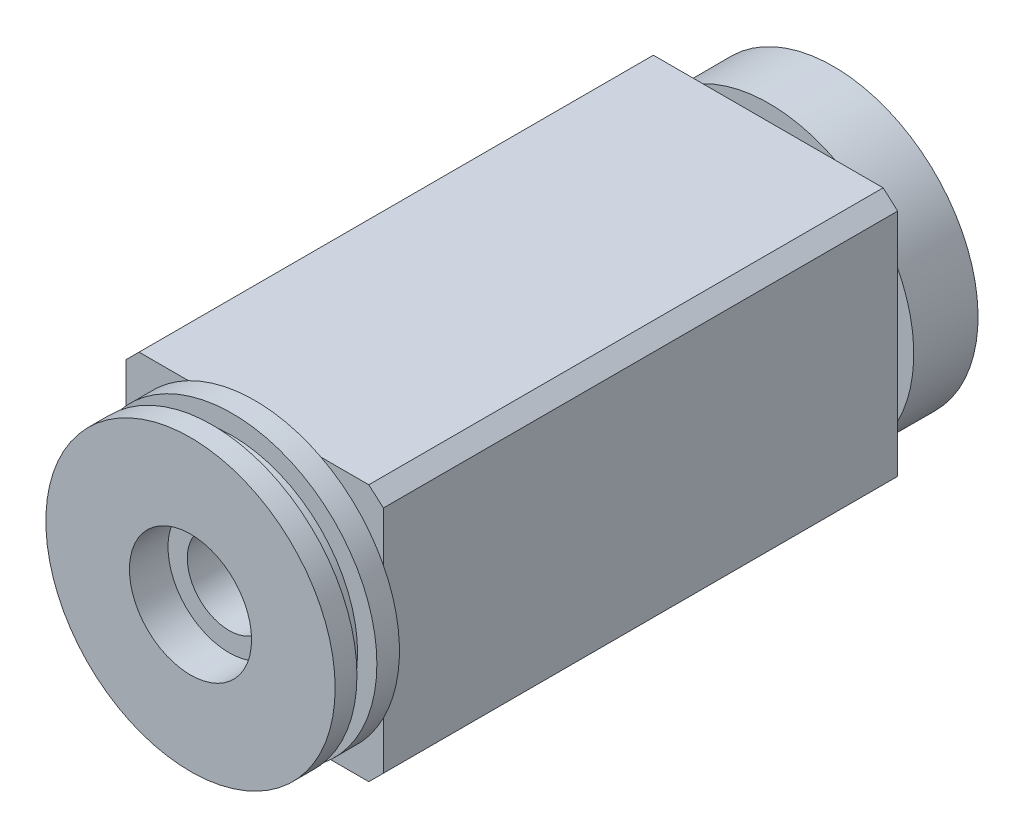
ISO-10303-21;
HEADER;
FILE_DESCRIPTION(('STEP AP214'),'2;1');
FILE_NAME('part.step','',(''),(''),'','','');
FILE_SCHEMA(('AUTOMOTIVE_DESIGN { 1 0 10303 214 1 1 1 1 }'));
ENDSEC;
DATA;
#1=APPLICATION_CONTEXT('core data for automotive mechanical design processes');
#2=APPLICATION_PROTOCOL_DEFINITION('international standard','automotive_design',2000,#1);
#3=PRODUCT_CONTEXT('',#1,'mechanical');
#4=PRODUCT('Part','Part','',(#3));
#5=PRODUCT_RELATED_PRODUCT_CATEGORY('part','',(#4));
#6=PRODUCT_DEFINITION_FORMATION('','',#4);
#7=PRODUCT_DEFINITION_CONTEXT('part definition',#1,'design');
#8=PRODUCT_DEFINITION('design','',#6,#7);
#9=PRODUCT_DEFINITION_SHAPE('','',#8);
#10=(LENGTH_UNIT() NAMED_UNIT(*) SI_UNIT(.MILLI.,.METRE.));
#11=(NAMED_UNIT(*) PLANE_ANGLE_UNIT() SI_UNIT($,.RADIAN.));
#12=(NAMED_UNIT(*) SI_UNIT($,.STERADIAN.) SOLID_ANGLE_UNIT());
#13=UNCERTAINTY_MEASURE_WITH_UNIT(LENGTH_MEASURE(1.E-05),#10,'distance_accuracy_value','');
#14=(GEOMETRIC_REPRESENTATION_CONTEXT(3) GLOBAL_UNCERTAINTY_ASSIGNED_CONTEXT((#13)) GLOBAL_UNIT_ASSIGNED_CONTEXT((#10,
#11,#12)) REPRESENTATION_CONTEXT('',''));
#15=CARTESIAN_POINT('',(0.,0.,0.));
#16=DIRECTION('',(0.,0.,1.));
#17=DIRECTION('',(1.,0.,0.));
#18=AXIS2_PLACEMENT_3D('',#15,#16,#17);
#19=CARTESIAN_POINT('',(0.,0.,90.));
#20=DIRECTION('',(0.,0.,-1.));
#21=DIRECTION('',(-1.,0.,0.));
#22=AXIS2_PLACEMENT_3D('',#19,#20,#21);
#23=CYLINDRICAL_SURFACE('',#22,22.5);
#24=CARTESIAN_POINT('',(0.,0.,80.));
#25=DIRECTION('',(0.,0.,1.));
#26=DIRECTION('',(1.,0.,0.));
#27=AXIS2_PLACEMENT_3D('',#24,#25,#26);
#28=CIRCLE('',#27,22.5);
#29=CARTESIAN_POINT('',(20.,10.3077640640442,80.));
#30=VERTEX_POINT('',#29);
#31=CARTESIAN_POINT('',(10.3077640640442,20.,80.));
#32=VERTEX_POINT('',#31);
#33=EDGE_CURVE('E245',#30,#32,#28,.T.);
#34=ORIENTED_EDGE('',*,*,#33,.T.);
#35=CARTESIAN_POINT('',(-10.3077640640442,20.,80.));
#36=VERTEX_POINT('',#35);
#37=EDGE_CURVE('E185',#32,#36,#28,.T.);
#38=ORIENTED_EDGE('',*,*,#37,.T.);
#39=CARTESIAN_POINT('',(-20.,10.3077640640442,80.));
#40=VERTEX_POINT('',#39);
#41=EDGE_CURVE('E181',#36,#40,#28,.T.);
#42=ORIENTED_EDGE('',*,*,#41,.T.);
#43=CARTESIAN_POINT('',(-20.,-10.3077640640442,80.));
#44=VERTEX_POINT('',#43);
#45=EDGE_CURVE('E254',#40,#44,#28,.T.);
#46=ORIENTED_EDGE('',*,*,#45,.T.);
#47=CARTESIAN_POINT('',(-10.3077640640442,-20.,80.));
#48=VERTEX_POINT('',#47);
#49=EDGE_CURVE('E183',#44,#48,#28,.T.);
#50=ORIENTED_EDGE('',*,*,#49,.T.);
#51=CARTESIAN_POINT('',(10.3077640640442,-20.,80.));
#52=VERTEX_POINT('',#51);
#53=EDGE_CURVE('E255',#48,#52,#28,.T.);
#54=ORIENTED_EDGE('',*,*,#53,.T.);
#55=CARTESIAN_POINT('',(20.,-10.3077640640442,80.));
#56=VERTEX_POINT('',#55);
#57=EDGE_CURVE('E241',#52,#56,#28,.T.);
#58=ORIENTED_EDGE('',*,*,#57,.T.);
#59=EDGE_CURVE('E191',#56,#30,#28,.T.);
#60=ORIENTED_EDGE('',*,*,#59,.T.);
#61=EDGE_LOOP('',(#34,#38,#42,#46,#50,#54,#58,#60));
#62=FACE_BOUND('',#61,.T.);
#63=CARTESIAN_POINT('',(0.,0.,83.51));
#64=DIRECTION('',(0.,0.,1.));
#65=DIRECTION('',(1.,0.,0.));
#66=AXIS2_PLACEMENT_3D('',#63,#64,#65);
#67=CIRCLE('',#66,22.5);
#68=CARTESIAN_POINT('',(22.5,0.,83.51));
#69=VERTEX_POINT('',#68);
#70=EDGE_CURVE('E356',#69,#69,#67,.T.);
#71=ORIENTED_EDGE('',*,*,#70,.F.);
#72=EDGE_LOOP('',(#71));
#73=FACE_BOUND('',#72,.T.);
#74=ADVANCED_FACE('F37',(#62,#73),#23,.T.);
#75=CARTESIAN_POINT('',(0.,0.,0.));
#76=DIRECTION('',(0.,0.,1.));
#77=DIRECTION('',(1.,0.,0.));
#78=AXIS2_PLACEMENT_3D('',#75,#76,#77);
#79=PLANE('',#78);
#80=CARTESIAN_POINT('',(0.,0.,0.));
#81=DIRECTION('',(0.,0.,-1.));
#82=DIRECTION('',(-1.,0.,0.));
#83=AXIS2_PLACEMENT_3D('',#80,#81,#82);
#84=CIRCLE('',#83,22.5);
#85=CARTESIAN_POINT('',(-20.,10.3077640640442,0.));
#86=VERTEX_POINT('',#85);
#87=CARTESIAN_POINT('',(-10.3077640640442,20.,0.));
#88=VERTEX_POINT('',#87);
#89=EDGE_CURVE('E176',#86,#88,#84,.T.);
#90=ORIENTED_EDGE('',*,*,#89,.F.);
#91=DIRECTION('',(0.,-1.,0.));
#92=VECTOR('',#91,1.);
#93=CARTESIAN_POINT('',(-20.,18.,0.));
#94=LINE('',#93,#92);
#95=CARTESIAN_POINT('',(-20.,18.,0.));
#96=VERTEX_POINT('',#95);
#97=EDGE_CURVE('E161',#96,#86,#94,.T.);
#98=ORIENTED_EDGE('',*,*,#97,.F.);
#99=DIRECTION('',(-0.707106781186548,-0.707106781186548,0.));
#100=VECTOR('',#99,1.);
#101=CARTESIAN_POINT('',(-20.,18.,0.));
#102=LINE('',#101,#100);
#103=CARTESIAN_POINT('',(-18.,20.,0.));
#104=VERTEX_POINT('',#103);
#105=EDGE_CURVE('E216',#104,#96,#102,.T.);
#106=ORIENTED_EDGE('',*,*,#105,.F.);
#107=DIRECTION('',(-1.,0.,0.));
#108=VECTOR('',#107,1.);
#109=CARTESIAN_POINT('',(-18.,20.,0.));
#110=LINE('',#109,#108);
#111=EDGE_CURVE('E212',#88,#104,#110,.T.);
#112=ORIENTED_EDGE('',*,*,#111,.F.);
#113=EDGE_LOOP('',(#90,#98,#106,#112));
#114=FACE_BOUND('',#113,.T.);
#115=ADVANCED_FACE('F326',(#114),#79,.F.);
#116=CARTESIAN_POINT('',(10.3077640640442,20.,0.));
#117=VERTEX_POINT('',#116);
#118=CARTESIAN_POINT('',(20.,10.3077640640442,0.));
#119=VERTEX_POINT('',#118);
#120=EDGE_CURVE('E11',#117,#119,#84,.T.);
#121=ORIENTED_EDGE('',*,*,#120,.F.);
#122=CARTESIAN_POINT('',(17.7358097334592,20.,0.));
#123=VERTEX_POINT('',#122);
#124=EDGE_CURVE('E213',#123,#117,#110,.T.);
#125=ORIENTED_EDGE('',*,*,#124,.F.);
#126=DIRECTION('',(-0.749478916761417,0.662028211883854,0.));
#127=VECTOR('',#126,1.);
#128=CARTESIAN_POINT('',(17.7358097334592,20.,0.));
#129=LINE('',#128,#127);
#130=CARTESIAN_POINT('',(20.,18.,0.));
#131=VERTEX_POINT('',#130);
#132=EDGE_CURVE('E206',#131,#123,#129,.T.);
#133=ORIENTED_EDGE('',*,*,#132,.F.);
#134=DIRECTION('',(0.,1.,0.));
#135=VECTOR('',#134,1.);
#136=CARTESIAN_POINT('',(20.,18.,0.));
#137=LINE('',#136,#135);
#138=EDGE_CURVE('E204',#119,#131,#137,.T.);
#139=ORIENTED_EDGE('',*,*,#138,.F.);
#140=EDGE_LOOP('',(#121,#125,#133,#139));
#141=FACE_BOUND('',#140,.T.);
#142=ADVANCED_FACE('F332',(#141),#79,.F.);
#143=CARTESIAN_POINT('',(20.,-10.3077640640442,0.));
#144=VERTEX_POINT('',#143);
#145=CARTESIAN_POINT('',(10.3077640640442,-20.,0.));
#146=VERTEX_POINT('',#145);
#147=EDGE_CURVE('E46',#144,#146,#84,.T.);
#148=ORIENTED_EDGE('',*,*,#147,.F.);
#149=CARTESIAN_POINT('',(20.,-17.7358097334592,0.));
#150=VERTEX_POINT('',#149);
#151=EDGE_CURVE('E203',#150,#144,#137,.T.);
#152=ORIENTED_EDGE('',*,*,#151,.F.);
#153=DIRECTION('',(0.707106781186546,0.707106781186548,0.));
#154=VECTOR('',#153,1.);
#155=CARTESIAN_POINT('',(17.7358097334592,-20.,0.));
#156=LINE('',#155,#154);
#157=CARTESIAN_POINT('',(17.7358097334592,-20.,0.));
#158=VERTEX_POINT('',#157);
#159=EDGE_CURVE('E207',#158,#150,#156,.T.);
#160=ORIENTED_EDGE('',*,*,#159,.F.);
#161=DIRECTION('',(1.,0.,0.));
#162=VECTOR('',#161,1.);
#163=CARTESIAN_POINT('',(-18.,-20.,0.));
#164=LINE('',#163,#162);
#165=EDGE_CURVE('E55',#146,#158,#164,.T.);
#166=ORIENTED_EDGE('',*,*,#165,.F.);
#167=EDGE_LOOP('',(#148,#152,#160,#166));
#168=FACE_BOUND('',#167,.T.);
#169=ADVANCED_FACE('F303',(#168),#79,.F.);
#170=CARTESIAN_POINT('',(0.,0.,80.));
#171=DIRECTION('',(0.,0.,1.));
#172=DIRECTION('',(1.,0.,0.));
#173=AXIS2_PLACEMENT_3D('',#170,#171,#172);
#174=PLANE('',#173);
#175=ORIENTED_EDGE('',*,*,#33,.F.);
#176=DIRECTION('',(0.,1.,0.));
#177=VECTOR('',#176,1.);
#178=CARTESIAN_POINT('',(20.,18.,80.));
#179=LINE('',#178,#177);
#180=CARTESIAN_POINT('',(20.,18.,80.));
#181=VERTEX_POINT('',#180);
#182=EDGE_CURVE('E279',#30,#181,#179,.T.);
#183=ORIENTED_EDGE('',*,*,#182,.T.);
#184=DIRECTION('',(-0.749478916761417,0.662028211883854,0.));
#185=VECTOR('',#184,1.);
#186=CARTESIAN_POINT('',(17.7358097334592,20.,80.));
#187=LINE('',#186,#185);
#188=CARTESIAN_POINT('',(17.7358097334592,20.,80.));
#189=VERTEX_POINT('',#188);
#190=EDGE_CURVE('E282',#181,#189,#187,.T.);
#191=ORIENTED_EDGE('',*,*,#190,.T.);
#192=DIRECTION('',(-1.,0.,0.));
#193=VECTOR('',#192,1.);
#194=CARTESIAN_POINT('',(-18.,20.,80.));
#195=LINE('',#194,#193);
#196=EDGE_CURVE('E286',#189,#32,#195,.T.);
#197=ORIENTED_EDGE('',*,*,#196,.T.);
#198=EDGE_LOOP('',(#175,#183,#191,#197));
#199=FACE_BOUND('',#198,.T.);
#200=ADVANCED_FACE('F406',(#199),#174,.T.);
#201=ORIENTED_EDGE('',*,*,#41,.F.);
#202=CARTESIAN_POINT('',(-18.,20.,80.));
#203=VERTEX_POINT('',#202);
#204=EDGE_CURVE('E285',#36,#203,#195,.T.);
#205=ORIENTED_EDGE('',*,*,#204,.T.);
#206=DIRECTION('',(-0.707106781186548,-0.707106781186548,0.));
#207=VECTOR('',#206,1.);
#208=CARTESIAN_POINT('',(-20.,18.,80.));
#209=LINE('',#208,#207);
#210=CARTESIAN_POINT('',(-20.,18.,80.));
#211=VERTEX_POINT('',#210);
#212=EDGE_CURVE('E223',#203,#211,#209,.T.);
#213=ORIENTED_EDGE('',*,*,#212,.T.);
#214=DIRECTION('',(0.,-1.,0.));
#215=VECTOR('',#214,1.);
#216=CARTESIAN_POINT('',(-20.,18.,80.));
#217=LINE('',#216,#215);
#218=EDGE_CURVE('E268',#211,#40,#217,.T.);
#219=ORIENTED_EDGE('',*,*,#218,.T.);
#220=EDGE_LOOP('',(#201,#205,#213,#219));
#221=FACE_BOUND('',#220,.T.);
#222=ADVANCED_FACE('F413',(#221),#174,.T.);
#223=ORIENTED_EDGE('',*,*,#49,.F.);
#224=CARTESIAN_POINT('',(-20.,-18.,80.));
#225=VERTEX_POINT('',#224);
#226=EDGE_CURVE('E219',#44,#225,#217,.T.);
#227=ORIENTED_EDGE('',*,*,#226,.T.);
#228=DIRECTION('',(0.707106781186551,-0.707106781186544,0.));
#229=VECTOR('',#228,1.);
#230=CARTESIAN_POINT('',(-18.,-20.,80.));
#231=LINE('',#230,#229);
#232=CARTESIAN_POINT('',(-18.,-20.,80.));
#233=VERTEX_POINT('',#232);
#234=EDGE_CURVE('E269',#225,#233,#231,.T.);
#235=ORIENTED_EDGE('',*,*,#234,.T.);
#236=DIRECTION('',(1.,0.,0.));
#237=VECTOR('',#236,1.);
#238=CARTESIAN_POINT('',(-18.,-20.,80.));
#239=LINE('',#238,#237);
#240=EDGE_CURVE('E273',#233,#48,#239,.T.);
#241=ORIENTED_EDGE('',*,*,#240,.T.);
#242=EDGE_LOOP('',(#223,#227,#235,#241));
#243=FACE_BOUND('',#242,.T.);
#244=ADVANCED_FACE('F316',(#243),#174,.T.);
#245=CARTESIAN_POINT('',(-20.,18.,80.));
#246=DIRECTION('',(1.,0.,0.));
#247=DIRECTION('',(0.,0.,-1.));
#248=AXIS2_PLACEMENT_3D('',#245,#246,#247);
#249=PLANE('',#248);
#250=ORIENTED_EDGE('',*,*,#97,.T.);
#251=CARTESIAN_POINT('',(-20.,-10.3077640640442,0.));
#252=VERTEX_POINT('',#251);
#253=EDGE_CURVE('E155',#86,#252,#94,.T.);
#254=ORIENTED_EDGE('',*,*,#253,.T.);
#255=CARTESIAN_POINT('',(-20.,-18.,0.));
#256=VERTEX_POINT('',#255);
#257=EDGE_CURVE('E157',#252,#256,#94,.T.);
#258=ORIENTED_EDGE('',*,*,#257,.T.);
#259=DIRECTION('',(0.,0.,-1.));
#260=VECTOR('',#259,1.);
#261=CARTESIAN_POINT('',(-20.,-18.,80.));
#262=LINE('',#261,#260);
#263=EDGE_CURVE('E240',#225,#256,#262,.T.);
#264=ORIENTED_EDGE('',*,*,#263,.F.);
#265=ORIENTED_EDGE('',*,*,#226,.F.);
#266=EDGE_CURVE('E264',#40,#44,#217,.T.);
#267=ORIENTED_EDGE('',*,*,#266,.F.);
#268=ORIENTED_EDGE('',*,*,#218,.F.);
#269=DIRECTION('',(0.,0.,-1.));
#270=VECTOR('',#269,1.);
#271=CARTESIAN_POINT('',(-20.,18.,80.));
#272=LINE('',#271,#270);
#273=EDGE_CURVE('E220',#211,#96,#272,.T.);
#274=ORIENTED_EDGE('',*,*,#273,.T.);
#275=EDGE_LOOP('',(#250,#254,#258,#264,#265,#267,#268,#274));
#276=FACE_BOUND('',#275,.T.);
#277=ADVANCED_FACE('F39',(#276),#249,.F.);
#278=CARTESIAN_POINT('',(-18.,-20.,80.));
#279=DIRECTION('',(0.707106781186544,0.707106781186551,0.));
#280=DIRECTION('',(-0.707106781186551,0.707106781186544,0.));
#281=AXIS2_PLACEMENT_3D('',#278,#279,#280);
#282=PLANE('',#281);
#283=DIRECTION('',(0.707106781186551,-0.707106781186544,0.));
#284=VECTOR('',#283,1.);
#285=CARTESIAN_POINT('',(-18.,-20.,0.));
#286=LINE('',#285,#284);
#287=CARTESIAN_POINT('',(-18.,-20.,0.));
#288=VERTEX_POINT('',#287);
#289=EDGE_CURVE('E167',#256,#288,#286,.T.);
#290=ORIENTED_EDGE('',*,*,#289,.T.);
#291=DIRECTION('',(0.,0.,-1.));
#292=VECTOR('',#291,1.);
#293=CARTESIAN_POINT('',(-18.,-20.,80.));
#294=LINE('',#293,#292);
#295=EDGE_CURVE('E238',#233,#288,#294,.T.);
#296=ORIENTED_EDGE('',*,*,#295,.F.);
#297=ORIENTED_EDGE('',*,*,#234,.F.);
#298=ORIENTED_EDGE('',*,*,#263,.T.);
#299=EDGE_LOOP('',(#290,#296,#297,#298));
#300=FACE_BOUND('',#299,.T.);
#301=ADVANCED_FACE('F318',(#300),#282,.F.);
#302=CARTESIAN_POINT('',(-18.,-20.,80.));
#303=DIRECTION('',(0.,1.,0.));
#304=DIRECTION('',(0.,0.,1.));
#305=AXIS2_PLACEMENT_3D('',#302,#303,#304);
#306=PLANE('',#305);
#307=CARTESIAN_POINT('',(-10.3077640640442,-20.,0.));
#308=VERTEX_POINT('',#307);
#309=EDGE_CURVE('E291',#288,#308,#164,.T.);
#310=ORIENTED_EDGE('',*,*,#309,.T.);
#311=EDGE_CURVE('E292',#308,#146,#164,.T.);
#312=ORIENTED_EDGE('',*,*,#311,.T.);
#313=ORIENTED_EDGE('',*,*,#165,.T.);
#314=DIRECTION('',(0.,0.,-1.));
#315=VECTOR('',#314,1.);
#316=CARTESIAN_POINT('',(17.7358097334592,-20.,80.));
#317=LINE('',#316,#315);
#318=CARTESIAN_POINT('',(17.7358097334592,-20.,80.));
#319=VERTEX_POINT('',#318);
#320=EDGE_CURVE('E235',#319,#158,#317,.T.);
#321=ORIENTED_EDGE('',*,*,#320,.F.);
#322=EDGE_CURVE('E272',#52,#319,#239,.T.);
#323=ORIENTED_EDGE('',*,*,#322,.F.);
#324=EDGE_CURVE('E277',#48,#52,#239,.T.);
#325=ORIENTED_EDGE('',*,*,#324,.F.);
#326=ORIENTED_EDGE('',*,*,#240,.F.);
#327=ORIENTED_EDGE('',*,*,#295,.T.);
#328=EDGE_LOOP('',(#310,#312,#313,#321,#323,#325,#326,#327));
#329=FACE_BOUND('',#328,.T.);
#330=ADVANCED_FACE('F296',(#329),#306,.F.);
#331=CARTESIAN_POINT('',(17.7358097334592,-20.,80.));
#332=DIRECTION('',(-0.707106781186549,0.707106781186546,0.));
#333=DIRECTION('',(-0.707106781186546,-0.707106781186549,0.));
#334=AXIS2_PLACEMENT_3D('',#331,#332,#333);
#335=PLANE('',#334);
#336=ORIENTED_EDGE('',*,*,#159,.T.);
#337=DIRECTION('',(0.,0.,-1.));
#338=VECTOR('',#337,1.);
#339=CARTESIAN_POINT('',(20.,-17.7358097334592,80.));
#340=LINE('',#339,#338);
#341=CARTESIAN_POINT('',(20.,-17.7358097334592,80.));
#342=VERTEX_POINT('',#341);
#343=EDGE_CURVE('E232',#342,#150,#340,.T.);
#344=ORIENTED_EDGE('',*,*,#343,.F.);
#345=DIRECTION('',(0.707106781186546,0.707106781186548,0.));
#346=VECTOR('',#345,1.);
#347=CARTESIAN_POINT('',(17.7358097334592,-20.,80.));
#348=LINE('',#347,#346);
#349=EDGE_CURVE('E276',#319,#342,#348,.T.);
#350=ORIENTED_EDGE('',*,*,#349,.F.);
#351=ORIENTED_EDGE('',*,*,#320,.T.);
#352=EDGE_LOOP('',(#336,#344,#350,#351));
#353=FACE_BOUND('',#352,.T.);
#354=ADVANCED_FACE('F300',(#353),#335,.F.);
#355=CARTESIAN_POINT('',(20.,18.,80.));
#356=DIRECTION('',(-1.,0.,0.));
#357=DIRECTION('',(0.,0.,1.));
#358=AXIS2_PLACEMENT_3D('',#355,#356,#357);
#359=PLANE('',#358);
#360=ORIENTED_EDGE('',*,*,#151,.T.);
#361=EDGE_CURVE('E200',#144,#119,#137,.T.);
#362=ORIENTED_EDGE('',*,*,#361,.T.);
#363=ORIENTED_EDGE('',*,*,#138,.T.);
#364=DIRECTION('',(0.,0.,-1.));
#365=VECTOR('',#364,1.);
#366=CARTESIAN_POINT('',(20.,18.,80.));
#367=LINE('',#366,#365);
#368=EDGE_CURVE('E229',#181,#131,#367,.T.);
#369=ORIENTED_EDGE('',*,*,#368,.F.);
#370=ORIENTED_EDGE('',*,*,#182,.F.);
#371=EDGE_CURVE('E283',#56,#30,#179,.T.);
#372=ORIENTED_EDGE('',*,*,#371,.F.);
#373=EDGE_CURVE('E280',#342,#56,#179,.T.);
#374=ORIENTED_EDGE('',*,*,#373,.F.);
#375=ORIENTED_EDGE('',*,*,#343,.T.);
#376=EDGE_LOOP('',(#360,#362,#363,#369,#370,#372,#374,#375));
#377=FACE_BOUND('',#376,.T.);
#378=ADVANCED_FACE('F304',(#377),#359,.F.);
#379=CARTESIAN_POINT('',(17.7358097334592,20.,80.));
#380=DIRECTION('',(-0.662028211883854,-0.749478916761417,0.));
#381=DIRECTION('',(0.749478916761417,-0.662028211883854,0.));
#382=AXIS2_PLACEMENT_3D('',#379,#380,#381);
#383=PLANE('',#382);
#384=ORIENTED_EDGE('',*,*,#132,.T.);
#385=DIRECTION('',(0.,0.,-1.));
#386=VECTOR('',#385,1.);
#387=CARTESIAN_POINT('',(17.7358097334592,20.,80.));
#388=LINE('',#387,#386);
#389=EDGE_CURVE('E226',#189,#123,#388,.T.);
#390=ORIENTED_EDGE('',*,*,#389,.F.);
#391=ORIENTED_EDGE('',*,*,#190,.F.);
#392=ORIENTED_EDGE('',*,*,#368,.T.);
#393=EDGE_LOOP('',(#384,#390,#391,#392));
#394=FACE_BOUND('',#393,.T.);
#395=ADVANCED_FACE('F439',(#394),#383,.F.);
#396=CARTESIAN_POINT('',(-18.,20.,80.));
#397=DIRECTION('',(0.,-1.,0.));
#398=DIRECTION('',(0.,0.,-1.));
#399=AXIS2_PLACEMENT_3D('',#396,#397,#398);
#400=PLANE('',#399);
#401=ORIENTED_EDGE('',*,*,#124,.T.);
#402=EDGE_CURVE('E217',#117,#88,#110,.T.);
#403=ORIENTED_EDGE('',*,*,#402,.T.);
#404=ORIENTED_EDGE('',*,*,#111,.T.);
#405=DIRECTION('',(0.,0.,-1.));
#406=VECTOR('',#405,1.);
#407=CARTESIAN_POINT('',(-18.,20.,80.));
#408=LINE('',#407,#406);
#409=EDGE_CURVE('E222',#203,#104,#408,.T.);
#410=ORIENTED_EDGE('',*,*,#409,.F.);
#411=ORIENTED_EDGE('',*,*,#204,.F.);
#412=EDGE_CURVE('E289',#32,#36,#195,.T.);
#413=ORIENTED_EDGE('',*,*,#412,.F.);
#414=ORIENTED_EDGE('',*,*,#196,.F.);
#415=ORIENTED_EDGE('',*,*,#389,.T.);
#416=EDGE_LOOP('',(#401,#403,#404,#410,#411,#413,#414,#415));
#417=FACE_BOUND('',#416,.T.);
#418=ADVANCED_FACE('F423',(#417),#400,.F.);
#419=CARTESIAN_POINT('',(-20.,18.,80.));
#420=DIRECTION('',(0.707106781186548,-0.707106781186548,0.));
#421=DIRECTION('',(0.707106781186548,0.707106781186548,0.));
#422=AXIS2_PLACEMENT_3D('',#419,#420,#421);
#423=PLANE('',#422);
#424=ORIENTED_EDGE('',*,*,#105,.T.);
#425=ORIENTED_EDGE('',*,*,#273,.F.);
#426=ORIENTED_EDGE('',*,*,#212,.F.);
#427=ORIENTED_EDGE('',*,*,#409,.T.);
#428=EDGE_LOOP('',(#424,#425,#426,#427));
#429=FACE_BOUND('',#428,.T.);
#430=ADVANCED_FACE('F405',(#429),#423,.F.);
#431=ORIENTED_EDGE('',*,*,#57,.F.);
#432=ORIENTED_EDGE('',*,*,#322,.T.);
#433=ORIENTED_EDGE('',*,*,#349,.T.);
#434=ORIENTED_EDGE('',*,*,#373,.T.);
#435=EDGE_LOOP('',(#431,#432,#433,#434));
#436=FACE_BOUND('',#435,.T.);
#437=ADVANCED_FACE('F310',(#436),#174,.T.);
#438=EDGE_CURVE('E63',#308,#252,#84,.T.);
#439=ORIENTED_EDGE('',*,*,#438,.F.);
#440=ORIENTED_EDGE('',*,*,#309,.F.);
#441=ORIENTED_EDGE('',*,*,#289,.F.);
#442=ORIENTED_EDGE('',*,*,#257,.F.);
#443=EDGE_LOOP('',(#439,#440,#441,#442));
#444=FACE_BOUND('',#443,.T.);
#445=ADVANCED_FACE('F166',(#444),#79,.F.);
#446=CARTESIAN_POINT('',(0.,0.,80.));
#447=DIRECTION('',(0.,0.,1.));
#448=DIRECTION('',(1.,0.,0.));
#449=AXIS2_PLACEMENT_3D('',#446,#447,#448);
#450=PLANE('',#449);
#451=ORIENTED_EDGE('',*,*,#45,.F.);
#452=ORIENTED_EDGE('',*,*,#266,.T.);
#453=EDGE_LOOP('',(#451,#452));
#454=FACE_BOUND('',#453,.T.);
#455=ADVANCED_FACE('F263',(#454),#450,.F.);
#456=ORIENTED_EDGE('',*,*,#53,.F.);
#457=ORIENTED_EDGE('',*,*,#324,.T.);
#458=EDGE_LOOP('',(#456,#457));
#459=FACE_BOUND('',#458,.T.);
#460=ADVANCED_FACE('F313',(#459),#450,.F.);
#461=ORIENTED_EDGE('',*,*,#59,.F.);
#462=ORIENTED_EDGE('',*,*,#371,.T.);
#463=EDGE_LOOP('',(#461,#462));
#464=FACE_BOUND('',#463,.T.);
#465=ADVANCED_FACE('F347',(#464),#450,.F.);
#466=ORIENTED_EDGE('',*,*,#37,.F.);
#467=ORIENTED_EDGE('',*,*,#412,.T.);
#468=EDGE_LOOP('',(#466,#467));
#469=FACE_BOUND('',#468,.T.);
#470=ADVANCED_FACE('F339',(#469),#450,.F.);
#471=CARTESIAN_POINT('',(0.,0.,86.61));
#472=DIRECTION('',(0.,0.,1.));
#473=DIRECTION('',(1.,0.,0.));
#474=AXIS2_PLACEMENT_3D('',#471,#472,#473);
#475=CIRCLE('',#474,22.5);
#476=CARTESIAN_POINT('',(22.5,0.,86.61));
#477=VERTEX_POINT('',#476);
#478=EDGE_CURVE('E352',#477,#477,#475,.T.);
#479=ORIENTED_EDGE('',*,*,#478,.T.);
#480=EDGE_LOOP('',(#479));
#481=FACE_BOUND('',#480,.T.);
#482=CARTESIAN_POINT('',(0.,0.,90.));
#483=DIRECTION('',(0.,0.,1.));
#484=DIRECTION('',(1.,0.,0.));
#485=AXIS2_PLACEMENT_3D('',#482,#483,#484);
#486=CIRCLE('',#485,22.5);
#487=CARTESIAN_POINT('',(22.5,0.,90.));
#488=VERTEX_POINT('',#487);
#489=EDGE_CURVE('E169',#488,#488,#486,.T.);
#490=ORIENTED_EDGE('',*,*,#489,.F.);
#491=EDGE_LOOP('',(#490));
#492=FACE_BOUND('',#491,.T.);
#493=ADVANCED_FACE('F328',(#481,#492),#23,.T.);
#494=CARTESIAN_POINT('',(0.,0.,90.));
#495=DIRECTION('',(0.,0.,1.));
#496=DIRECTION('',(1.,0.,0.));
#497=AXIS2_PLACEMENT_3D('',#494,#495,#496);
#498=PLANE('',#497);
#499=CARTESIAN_POINT('',(0.,0.,90.));
#500=DIRECTION('',(0.,0.,1.));
#501=DIRECTION('',(1.,0.,0.));
#502=AXIS2_PLACEMENT_3D('',#499,#500,#501);
#503=CIRCLE('',#502,9.5);
#504=CARTESIAN_POINT('',(9.5,0.,90.));
#505=VERTEX_POINT('',#504);
#506=EDGE_CURVE('E369',#505,#505,#503,.T.);
#507=ORIENTED_EDGE('',*,*,#506,.F.);
#508=EDGE_LOOP('',(#507));
#509=FACE_BOUND('',#508,.T.);
#510=ORIENTED_EDGE('',*,*,#489,.T.);
#511=EDGE_LOOP('',(#510));
#512=FACE_BOUND('',#511,.T.);
#513=ADVANCED_FACE('F338',(#509,#512),#498,.T.);
#514=CARTESIAN_POINT('',(0.,0.,0.));
#515=DIRECTION('',(0.,0.,-1.));
#516=DIRECTION('',(-1.,0.,0.));
#517=AXIS2_PLACEMENT_3D('',#514,#515,#516);
#518=PLANE('',#517);
#519=ORIENTED_EDGE('',*,*,#253,.F.);
#520=EDGE_CURVE('E170',#252,#86,#84,.T.);
#521=ORIENTED_EDGE('',*,*,#520,.F.);
#522=EDGE_LOOP('',(#519,#521));
#523=FACE_BOUND('',#522,.T.);
#524=ADVANCED_FACE('F171',(#523),#518,.F.);
#525=ORIENTED_EDGE('',*,*,#402,.F.);
#526=EDGE_CURVE('E48',#88,#117,#84,.T.);
#527=ORIENTED_EDGE('',*,*,#526,.F.);
#528=EDGE_LOOP('',(#525,#527));
#529=FACE_BOUND('',#528,.T.);
#530=ADVANCED_FACE('F395',(#529),#518,.F.);
#531=ORIENTED_EDGE('',*,*,#361,.F.);
#532=EDGE_CURVE('E192',#119,#144,#84,.T.);
#533=ORIENTED_EDGE('',*,*,#532,.F.);
#534=EDGE_LOOP('',(#531,#533));
#535=FACE_BOUND('',#534,.T.);
#536=ADVANCED_FACE('F198',(#535),#518,.F.);
#537=CARTESIAN_POINT('',(0.,0.,-10.));
#538=DIRECTION('',(0.,0.,1.));
#539=DIRECTION('',(1.,0.,0.));
#540=AXIS2_PLACEMENT_3D('',#537,#538,#539);
#541=CYLINDRICAL_SURFACE('',#540,22.5);
#542=CARTESIAN_POINT('',(0.,0.,-10.));
#543=DIRECTION('',(0.,0.,-1.));
#544=DIRECTION('',(-1.,0.,0.));
#545=AXIS2_PLACEMENT_3D('',#542,#543,#544);
#546=CIRCLE('',#545,22.5);
#547=CARTESIAN_POINT('',(-22.5,0.,-10.));
#548=VERTEX_POINT('',#547);
#549=EDGE_CURVE('E188',#548,#548,#546,.T.);
#550=ORIENTED_EDGE('',*,*,#549,.F.);
#551=EDGE_LOOP('',(#550));
#552=FACE_BOUND('',#551,.T.);
#553=ORIENTED_EDGE('',*,*,#89,.T.);
#554=ORIENTED_EDGE('',*,*,#526,.T.);
#555=ORIENTED_EDGE('',*,*,#120,.T.);
#556=ORIENTED_EDGE('',*,*,#532,.T.);
#557=ORIENTED_EDGE('',*,*,#147,.T.);
#558=EDGE_CURVE('E174',#146,#308,#84,.T.);
#559=ORIENTED_EDGE('',*,*,#558,.T.);
#560=ORIENTED_EDGE('',*,*,#438,.T.);
#561=ORIENTED_EDGE('',*,*,#520,.T.);
#562=EDGE_LOOP('',(#553,#554,#555,#556,#557,#559,#560,#561));
#563=FACE_BOUND('',#562,.T.);
#564=ADVANCED_FACE('F178',(#552,#563),#541,.T.);
#565=CARTESIAN_POINT('',(0.,0.,-10.));
#566=DIRECTION('',(0.,0.,-1.));
#567=DIRECTION('',(-1.,0.,0.));
#568=AXIS2_PLACEMENT_3D('',#565,#566,#567);
#569=PLANE('',#568);
#570=CARTESIAN_POINT('',(0.,0.,-10.));
#571=DIRECTION('',(0.,0.,-1.));
#572=DIRECTION('',(-1.,0.,0.));
#573=AXIS2_PLACEMENT_3D('',#570,#571,#572);
#574=CIRCLE('',#573,9.5);
#575=CARTESIAN_POINT('',(-9.5,0.,-10.));
#576=VERTEX_POINT('',#575);
#577=EDGE_CURVE('E373',#576,#576,#574,.T.);
#578=ORIENTED_EDGE('',*,*,#577,.F.);
#579=EDGE_LOOP('',(#578));
#580=FACE_BOUND('',#579,.T.);
#581=ORIENTED_EDGE('',*,*,#549,.T.);
#582=EDGE_LOOP('',(#581));
#583=FACE_BOUND('',#582,.T.);
#584=ADVANCED_FACE('F383',(#580,#583),#569,.T.);
#585=ORIENTED_EDGE('',*,*,#311,.F.);
#586=ORIENTED_EDGE('',*,*,#558,.F.);
#587=EDGE_LOOP('',(#585,#586));
#588=FACE_BOUND('',#587,.T.);
#589=ADVANCED_FACE('F386',(#588),#518,.F.);
#590=CARTESIAN_POINT('',(0.,0.,-4.));
#591=DIRECTION('',(0.,0.,-1.));
#592=DIRECTION('',(-1.,0.,0.));
#593=AXIS2_PLACEMENT_3D('',#590,#591,#592);
#594=CYLINDRICAL_SURFACE('',#593,9.5);
#595=CARTESIAN_POINT('',(0.,0.,-4.));
#596=DIRECTION('',(0.,0.,-1.));
#597=DIRECTION('',(-1.,0.,0.));
#598=AXIS2_PLACEMENT_3D('',#595,#596,#597);
#599=CIRCLE('',#598,9.5);
#600=CARTESIAN_POINT('',(-9.5,0.,-4.));
#601=VERTEX_POINT('',#600);
#602=EDGE_CURVE('E175',#601,#601,#599,.T.);
#603=ORIENTED_EDGE('',*,*,#602,.F.);
#604=EDGE_LOOP('',(#603));
#605=FACE_BOUND('',#604,.T.);
#606=ORIENTED_EDGE('',*,*,#577,.T.);
#607=EDGE_LOOP('',(#606));
#608=FACE_BOUND('',#607,.T.);
#609=ADVANCED_FACE('F381',(#605,#608),#594,.F.);
#610=CARTESIAN_POINT('',(0.,0.,-4.));
#611=DIRECTION('',(0.,0.,-1.));
#612=DIRECTION('',(-1.,0.,0.));
#613=AXIS2_PLACEMENT_3D('',#610,#611,#612);
#614=PLANE('',#613);
#615=CARTESIAN_POINT('',(0.,0.,-4.));
#616=DIRECTION('',(0.,0.,-1.));
#617=DIRECTION('',(-1.,0.,0.));
#618=AXIS2_PLACEMENT_3D('',#615,#616,#617);
#619=CIRCLE('',#618,6.5);
#620=CARTESIAN_POINT('',(-6.5,0.,-4.));
#621=VERTEX_POINT('',#620);
#622=EDGE_CURVE('E366',#621,#621,#619,.T.);
#623=ORIENTED_EDGE('',*,*,#622,.F.);
#624=EDGE_LOOP('',(#623));
#625=FACE_BOUND('',#624,.T.);
#626=ORIENTED_EDGE('',*,*,#602,.T.);
#627=EDGE_LOOP('',(#626));
#628=FACE_BOUND('',#627,.T.);
#629=ADVANCED_FACE('F555',(#625,#628),#614,.T.);
#630=CARTESIAN_POINT('',(0.,0.,84.));
#631=DIRECTION('',(0.,0.,1.));
#632=DIRECTION('',(1.,0.,0.));
#633=AXIS2_PLACEMENT_3D('',#630,#631,#632);
#634=CYLINDRICAL_SURFACE('',#633,9.5);
#635=CARTESIAN_POINT('',(0.,0.,84.));
#636=DIRECTION('',(0.,0.,1.));
#637=DIRECTION('',(1.,0.,0.));
#638=AXIS2_PLACEMENT_3D('',#635,#636,#637);
#639=CIRCLE('',#638,9.5);
#640=CARTESIAN_POINT('',(9.5,0.,84.));
#641=VERTEX_POINT('',#640);
#642=EDGE_CURVE('E370',#641,#641,#639,.T.);
#643=ORIENTED_EDGE('',*,*,#642,.F.);
#644=EDGE_LOOP('',(#643));
#645=FACE_BOUND('',#644,.T.);
#646=ORIENTED_EDGE('',*,*,#506,.T.);
#647=EDGE_LOOP('',(#646));
#648=FACE_BOUND('',#647,.T.);
#649=ADVANCED_FACE('F568',(#645,#648),#634,.F.);
#650=CARTESIAN_POINT('',(0.,0.,84.));
#651=DIRECTION('',(0.,0.,1.));
#652=DIRECTION('',(1.,0.,0.));
#653=AXIS2_PLACEMENT_3D('',#650,#651,#652);
#654=PLANE('',#653);
#655=CARTESIAN_POINT('',(0.,0.,84.));
#656=DIRECTION('',(0.,0.,1.));
#657=DIRECTION('',(1.,0.,0.));
#658=AXIS2_PLACEMENT_3D('',#655,#656,#657);
#659=CIRCLE('',#658,6.5);
#660=CARTESIAN_POINT('',(6.5,0.,84.));
#661=VERTEX_POINT('',#660);
#662=EDGE_CURVE('E41',#661,#661,#659,.T.);
#663=ORIENTED_EDGE('',*,*,#662,.F.);
#664=EDGE_LOOP('',(#663));
#665=FACE_BOUND('',#664,.T.);
#666=ORIENTED_EDGE('',*,*,#642,.T.);
#667=EDGE_LOOP('',(#666));
#668=FACE_BOUND('',#667,.T.);
#669=ADVANCED_FACE('F573',(#665,#668),#654,.T.);
#670=CARTESIAN_POINT('',(0.,0.,90.));
#671=DIRECTION('',(0.,0.,-1.));
#672=DIRECTION('',(-1.,0.,0.));
#673=AXIS2_PLACEMENT_3D('',#670,#671,#672);
#674=CYLINDRICAL_SURFACE('',#673,6.5);
#675=ORIENTED_EDGE('',*,*,#622,.T.);
#676=EDGE_LOOP('',(#675));
#677=FACE_BOUND('',#676,.T.);
#678=ORIENTED_EDGE('',*,*,#662,.T.);
#679=EDGE_LOOP('',(#678));
#680=FACE_BOUND('',#679,.T.);
#681=ADVANCED_FACE('F590',(#677,#680),#674,.F.);
#682=CARTESIAN_POINT('',(0.,0.,83.51));
#683=DIRECTION('',(0.,0.,1.));
#684=DIRECTION('',(1.,0.,0.));
#685=AXIS2_PLACEMENT_3D('',#682,#683,#684);
#686=PLANE('',#685);
#687=CARTESIAN_POINT('',(0.,0.,83.51));
#688=DIRECTION('',(0.,0.,1.));
#689=DIRECTION('',(1.,0.,0.));
#690=AXIS2_PLACEMENT_3D('',#687,#688,#689);
#691=CIRCLE('',#690,19.5);
#692=CARTESIAN_POINT('',(19.5,0.,83.51));
#693=VERTEX_POINT('',#692);
#694=EDGE_CURVE('E357',#693,#693,#691,.T.);
#695=ORIENTED_EDGE('',*,*,#694,.F.);
#696=EDGE_LOOP('',(#695));
#697=FACE_BOUND('',#696,.T.);
#698=ORIENTED_EDGE('',*,*,#70,.T.);
#699=EDGE_LOOP('',(#698));
#700=FACE_BOUND('',#699,.T.);
#701=ADVANCED_FACE('F599',(#697,#700),#686,.T.);
#702=CARTESIAN_POINT('',(0.,0.,86.61));
#703=DIRECTION('',(0.,0.,1.));
#704=DIRECTION('',(1.,0.,0.));
#705=AXIS2_PLACEMENT_3D('',#702,#703,#704);
#706=PLANE('',#705);
#707=CARTESIAN_POINT('',(0.,0.,86.61));
#708=DIRECTION('',(0.,0.,1.));
#709=DIRECTION('',(1.,0.,0.));
#710=AXIS2_PLACEMENT_3D('',#707,#708,#709);
#711=CIRCLE('',#710,19.5);
#712=CARTESIAN_POINT('',(19.5,0.,86.61));
#713=VERTEX_POINT('',#712);
#714=EDGE_CURVE('E362',#713,#713,#711,.T.);
#715=ORIENTED_EDGE('',*,*,#714,.T.);
#716=EDGE_LOOP('',(#715));
#717=FACE_BOUND('',#716,.T.);
#718=ORIENTED_EDGE('',*,*,#478,.F.);
#719=EDGE_LOOP('',(#718));
#720=FACE_BOUND('',#719,.T.);
#721=ADVANCED_FACE('F617',(#717,#720),#706,.F.);
#722=CARTESIAN_POINT('',(0.,0.,83.51));
#723=DIRECTION('',(0.,0.,1.));
#724=DIRECTION('',(1.,0.,0.));
#725=AXIS2_PLACEMENT_3D('',#722,#723,#724);
#726=CYLINDRICAL_SURFACE('',#725,19.5);
#727=CARTESIAN_POINT('',(19.5,0.,83.51));
#728=CARTESIAN_POINT('',(19.5,0.,83.5422916666667));
#729=CARTESIAN_POINT('',(19.5,0.,83.5745833333333));
#730=CARTESIAN_POINT('',(19.5,0.,83.6391666666667));
#731=CARTESIAN_POINT('',(19.5,0.,83.6714583333333));
#732=CARTESIAN_POINT('',(19.5,0.,83.7360416666667));
#733=CARTESIAN_POINT('',(19.5,0.,83.7683333333333));
#734=CARTESIAN_POINT('',(19.5,0.,83.8329166666666));
#735=CARTESIAN_POINT('',(19.5,0.,83.8652083333333));
#736=CARTESIAN_POINT('',(19.5,0.,83.9297916666667));
#737=CARTESIAN_POINT('',(19.5,0.,83.9620833333333));
#738=CARTESIAN_POINT('',(19.5,0.,84.0266666666667));
#739=CARTESIAN_POINT('',(19.5,0.,84.0589583333333));
#740=CARTESIAN_POINT('',(19.5,0.,84.1235416666667));
#741=CARTESIAN_POINT('',(19.5,0.,84.1558333333333));
#742=CARTESIAN_POINT('',(19.5,0.,84.2204166666667));
#743=CARTESIAN_POINT('',(19.5,0.,84.2527083333333));
#744=CARTESIAN_POINT('',(19.5,0.,84.3172916666666));
#745=CARTESIAN_POINT('',(19.5,0.,84.3495833333333));
#746=CARTESIAN_POINT('',(19.5,0.,84.4141666666666));
#747=CARTESIAN_POINT('',(19.5,0.,84.4464583333333));
#748=CARTESIAN_POINT('',(19.5,0.,84.5110416666666));
#749=CARTESIAN_POINT('',(19.5,0.,84.5433333333333));
#750=CARTESIAN_POINT('',(19.5,0.,84.6079166666667));
#751=CARTESIAN_POINT('',(19.5,0.,84.6402083333333));
#752=CARTESIAN_POINT('',(19.5,0.,84.7047916666667));
#753=CARTESIAN_POINT('',(19.5,0.,84.7370833333333));
#754=CARTESIAN_POINT('',(19.5,0.,84.8016666666666));
#755=CARTESIAN_POINT('',(19.5,0.,84.8339583333333));
#756=CARTESIAN_POINT('',(19.5,0.,84.8985416666666));
#757=CARTESIAN_POINT('',(19.5,0.,84.9308333333333));
#758=CARTESIAN_POINT('',(19.5,0.,84.9954166666667));
#759=CARTESIAN_POINT('',(19.5,0.,85.0277083333333));
#760=CARTESIAN_POINT('',(19.5,0.,85.0922916666667));
#761=CARTESIAN_POINT('',(19.5,0.,85.1245833333333));
#762=CARTESIAN_POINT('',(19.5,0.,85.1891666666667));
#763=CARTESIAN_POINT('',(19.5,0.,85.2214583333333));
#764=CARTESIAN_POINT('',(19.5,0.,85.2860416666667));
#765=CARTESIAN_POINT('',(19.5,0.,85.3183333333333));
#766=CARTESIAN_POINT('',(19.5,0.,85.3829166666667));
#767=CARTESIAN_POINT('',(19.5,0.,85.4152083333333));
#768=CARTESIAN_POINT('',(19.5,0.,85.4797916666667));
#769=CARTESIAN_POINT('',(19.5,0.,85.5120833333333));
#770=CARTESIAN_POINT('',(19.5,0.,85.5766666666667));
#771=CARTESIAN_POINT('',(19.5,0.,85.6089583333333));
#772=CARTESIAN_POINT('',(19.5,0.,85.6735416666667));
#773=CARTESIAN_POINT('',(19.5,0.,85.7058333333333));
#774=CARTESIAN_POINT('',(19.5,0.,85.7704166666666));
#775=CARTESIAN_POINT('',(19.5,0.,85.8027083333333));
#776=CARTESIAN_POINT('',(19.5,0.,85.8672916666666));
#777=CARTESIAN_POINT('',(19.5,0.,85.8995833333333));
#778=CARTESIAN_POINT('',(19.5,0.,85.9641666666667));
#779=CARTESIAN_POINT('',(19.5,0.,85.9964583333333));
#780=CARTESIAN_POINT('',(19.5,0.,86.0610416666667));
#781=CARTESIAN_POINT('',(19.5,0.,86.0933333333333));
#782=CARTESIAN_POINT('',(19.5,0.,86.1579166666667));
#783=CARTESIAN_POINT('',(19.5,0.,86.1902083333333));
#784=CARTESIAN_POINT('',(19.5,0.,86.2547916666666));
#785=CARTESIAN_POINT('',(19.5,0.,86.2870833333333));
#786=CARTESIAN_POINT('',(19.5,0.,86.3516666666667));
#787=CARTESIAN_POINT('',(19.5,0.,86.3839583333333));
#788=CARTESIAN_POINT('',(19.5,0.,86.4485416666667));
#789=CARTESIAN_POINT('',(19.5,0.,86.4808333333333));
#790=CARTESIAN_POINT('',(19.5,0.,86.5454166666667));
#791=CARTESIAN_POINT('',(19.5,0.,86.5777083333333));
#792=CARTESIAN_POINT('',(19.5,0.,86.61));
#793=B_SPLINE_CURVE_WITH_KNOTS('',3,(#727,#728,#729,#730,#731,#732,#733,#734,#735,#736,#737,
#738,#739,#740,#741,#742,#743,#744,#745,#746,#747,#748,#749,#750,#751,#752,#753,#754,#755,#756,
#757,#758,#759,#760,#761,#762,#763,#764,#765,#766,#767,#768,#769,#770,#771,#772,#773,#774,#775,
#776,#777,#778,#779,#780,#781,#782,#783,#784,#785,#786,#787,#788,#789,#790,#791,#792),
.UNSPECIFIED.,.F.,.F.,(4,2,2,2,2,2,2,2,2,2,2,2,2,2,2,2,2,2,2,2,2,2,2,2,2,2,2,2,2,2,2,2,4),(0.,
0.0968749999999963,0.193749999999993,0.290624999999989,0.387499999999999,0.484374999999995,
0.581249999999991,0.678124999999988,0.774999999999998,0.871874999999994,0.96874999999999,
1.065625,1.1625,1.25937499999999,1.35624999999999,1.453125,1.55,1.64687499999999,1.74375,
1.840625,1.93749999999999,2.03437499999999,2.13125,2.228125,2.32499999999999,2.421875,2.51875,
2.615625,2.71249999999999,2.809375,2.90625,3.003125,3.09999999999999),.UNSPECIFIED.);
#794=EDGE_CURVE('BSEAM627',#693,#713,#793,.T.);
#795=ORIENTED_EDGE('',*,*,#694,.T.);
#796=ORIENTED_EDGE('',*,*,#714,.F.);
#797=ORIENTED_EDGE('',*,*,#794,.T.);
#798=ORIENTED_EDGE('',*,*,#794,.F.);
#799=EDGE_LOOP('',(#795,#797,#796,#798));
#800=FACE_BOUND('',#799,.T.);
#801=ADVANCED_FACE('F627',(#800),#726,.T.);
#802=CLOSED_SHELL('',(#74,#115,#142,#169,#200,#222,#244,#277,#301,#330,#354,#378,#395,#418,#430,
#437,#445,#455,#460,#465,#470,#493,#513,#524,#530,#536,#564,#584,#589,#609,#629,#649,#669,#681,
#701,#721,#801));
#803=MANIFOLD_SOLID_BREP('B2',#802);
#804=ADVANCED_BREP_SHAPE_REPRESENTATION('',(#18,#803),#14);
#805=SHAPE_DEFINITION_REPRESENTATION(#9,#804);
ENDSEC;
END-ISO-10303-21;
